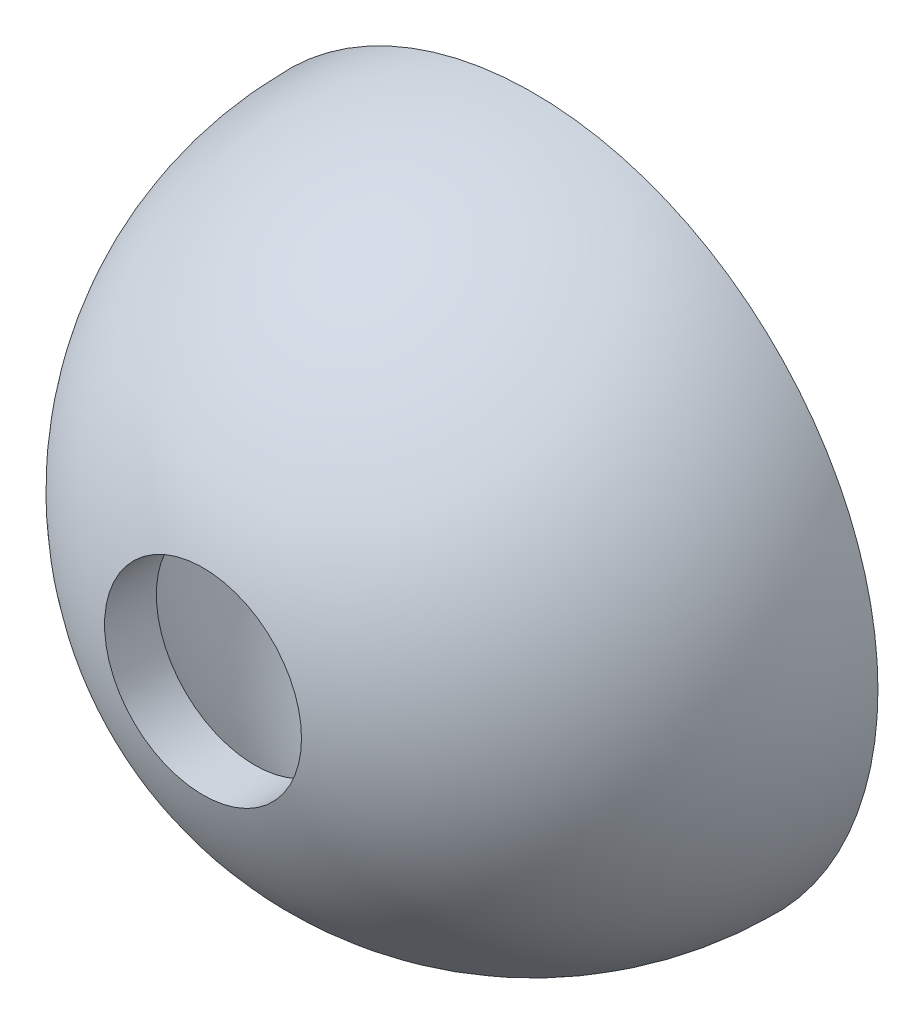
ISO-10303-21;
HEADER;
FILE_DESCRIPTION(('STEP AP214'),'2;1');
FILE_NAME('part.step','',(''),(''),'','','');
FILE_SCHEMA(('AUTOMOTIVE_DESIGN { 1 0 10303 214 1 1 1 1 }'));
ENDSEC;
DATA;
#1=APPLICATION_CONTEXT('core data for automotive mechanical design processes');
#2=APPLICATION_PROTOCOL_DEFINITION('international standard','automotive_design',2000,#1);
#3=PRODUCT_CONTEXT('',#1,'mechanical');
#4=PRODUCT('Part','Part','',(#3));
#5=PRODUCT_RELATED_PRODUCT_CATEGORY('part','',(#4));
#6=PRODUCT_DEFINITION_FORMATION('','',#4);
#7=PRODUCT_DEFINITION_CONTEXT('part definition',#1,'design');
#8=PRODUCT_DEFINITION('design','',#6,#7);
#9=PRODUCT_DEFINITION_SHAPE('','',#8);
#10=(LENGTH_UNIT() NAMED_UNIT(*) SI_UNIT(.MILLI.,.METRE.));
#11=(NAMED_UNIT(*) PLANE_ANGLE_UNIT() SI_UNIT($,.RADIAN.));
#12=(NAMED_UNIT(*) SI_UNIT($,.STERADIAN.) SOLID_ANGLE_UNIT());
#13=UNCERTAINTY_MEASURE_WITH_UNIT(LENGTH_MEASURE(1.E-05),#10,'distance_accuracy_value','');
#14=(GEOMETRIC_REPRESENTATION_CONTEXT(3) GLOBAL_UNCERTAINTY_ASSIGNED_CONTEXT((#13)) GLOBAL_UNIT_ASSIGNED_CONTEXT((#10,
#11,#12)) REPRESENTATION_CONTEXT('',''));
#15=CARTESIAN_POINT('',(0.,0.,0.));
#16=DIRECTION('',(0.,0.,1.));
#17=DIRECTION('',(1.,0.,0.));
#18=AXIS2_PLACEMENT_3D('',#15,#16,#17);
#19=CARTESIAN_POINT('',(0.,0.,0.));
#20=DIRECTION('',(0.,0.,1.));
#21=DIRECTION('',(1.,0.,0.));
#22=AXIS2_PLACEMENT_3D('',#19,#20,#21);
#23=SPHERICAL_SURFACE('',#22,7.);
#24=CARTESIAN_POINT('',(0.,0.,0.));
#25=DIRECTION('',(0.,0.,1.));
#26=DIRECTION('',(1.,0.,0.));
#27=AXIS2_PLACEMENT_3D('',#24,#25,#26);
#28=CIRCLE('',#27,7.);
#29=CARTESIAN_POINT('',(7.,0.,0.));
#30=VERTEX_POINT('',#29);
#31=EDGE_CURVE('E10',#30,#30,#28,.T.);
#32=ORIENTED_EDGE('',*,*,#31,.T.);
#33=EDGE_LOOP('',(#32));
#34=FACE_BOUND('',#33,.T.);
#35=CARTESIAN_POINT('',(0.,0.,6.70820393249937));
#36=DIRECTION('',(0.,0.,1.));
#37=DIRECTION('',(1.,0.,0.));
#38=AXIS2_PLACEMENT_3D('',#35,#36,#37);
#39=CIRCLE('',#38,2.);
#40=CARTESIAN_POINT('',(2.,0.,6.70820393249937));
#41=VERTEX_POINT('',#40);
#42=EDGE_CURVE('E49',#41,#41,#39,.T.);
#43=ORIENTED_EDGE('',*,*,#42,.F.);
#44=EDGE_LOOP('',(#43));
#45=FACE_BOUND('',#44,.T.);
#46=ADVANCED_FACE('F35',(#34,#45),#23,.T.);
#47=CARTESIAN_POINT('',(7.,0.,0.));
#48=DIRECTION('',(0.,0.,-1.));
#49=DIRECTION('',(-1.,0.,0.));
#50=AXIS2_PLACEMENT_3D('',#47,#48,#49);
#51=PLANE('',#50);
#52=CARTESIAN_POINT('',(0.,0.,0.));
#53=DIRECTION('',(0.,0.,1.));
#54=DIRECTION('',(1.,0.,0.));
#55=AXIS2_PLACEMENT_3D('',#52,#53,#54);
#56=CIRCLE('',#55,6.);
#57=CARTESIAN_POINT('',(6.,0.,0.));
#58=VERTEX_POINT('',#57);
#59=EDGE_CURVE('E41',#58,#58,#56,.T.);
#60=ORIENTED_EDGE('',*,*,#59,.T.);
#61=EDGE_LOOP('',(#60));
#62=FACE_BOUND('',#61,.T.);
#63=ORIENTED_EDGE('',*,*,#31,.F.);
#64=EDGE_LOOP('',(#63));
#65=FACE_BOUND('',#64,.T.);
#66=ADVANCED_FACE('F59',(#62,#65),#51,.T.);
#67=CARTESIAN_POINT('',(0.,0.,0.));
#68=DIRECTION('',(0.,0.,1.));
#69=DIRECTION('',(1.,0.,0.));
#70=AXIS2_PLACEMENT_3D('',#67,#68,#69);
#71=SPHERICAL_SURFACE('',#70,6.);
#72=CARTESIAN_POINT('',(0.,0.,5.65685424949238));
#73=DIRECTION('',(0.,0.,1.));
#74=DIRECTION('',(1.,0.,0.));
#75=AXIS2_PLACEMENT_3D('',#72,#73,#74);
#76=CIRCLE('',#75,2.);
#77=CARTESIAN_POINT('',(2.,0.,5.65685424949238));
#78=VERTEX_POINT('',#77);
#79=EDGE_CURVE('E45',#78,#78,#76,.T.);
#80=ORIENTED_EDGE('',*,*,#79,.T.);
#81=EDGE_LOOP('',(#80));
#82=FACE_BOUND('',#81,.T.);
#83=ORIENTED_EDGE('',*,*,#59,.F.);
#84=EDGE_LOOP('',(#83));
#85=FACE_BOUND('',#84,.T.);
#86=ADVANCED_FACE('F63',(#82,#85),#71,.F.);
#87=CARTESIAN_POINT('',(0.,0.,12.3791234538441));
#88=DIRECTION('',(0.,0.,1.));
#89=DIRECTION('',(1.,0.,0.));
#90=AXIS2_PLACEMENT_3D('',#87,#88,#89);
#91=CYLINDRICAL_SURFACE('',#90,2.);
#92=ORIENTED_EDGE('',*,*,#42,.T.);
#93=EDGE_LOOP('',(#92));
#94=FACE_BOUND('',#93,.T.);
#95=ORIENTED_EDGE('',*,*,#79,.F.);
#96=EDGE_LOOP('',(#95));
#97=FACE_BOUND('',#96,.T.);
#98=ADVANCED_FACE('F55',(#94,#97),#91,.F.);
#99=CLOSED_SHELL('',(#46,#66,#86,#98));
#100=MANIFOLD_SOLID_BREP('B2',#99);
#101=ADVANCED_BREP_SHAPE_REPRESENTATION('',(#18,#100),#14);
#102=SHAPE_DEFINITION_REPRESENTATION(#9,#101);
ENDSEC;
END-ISO-10303-21;
